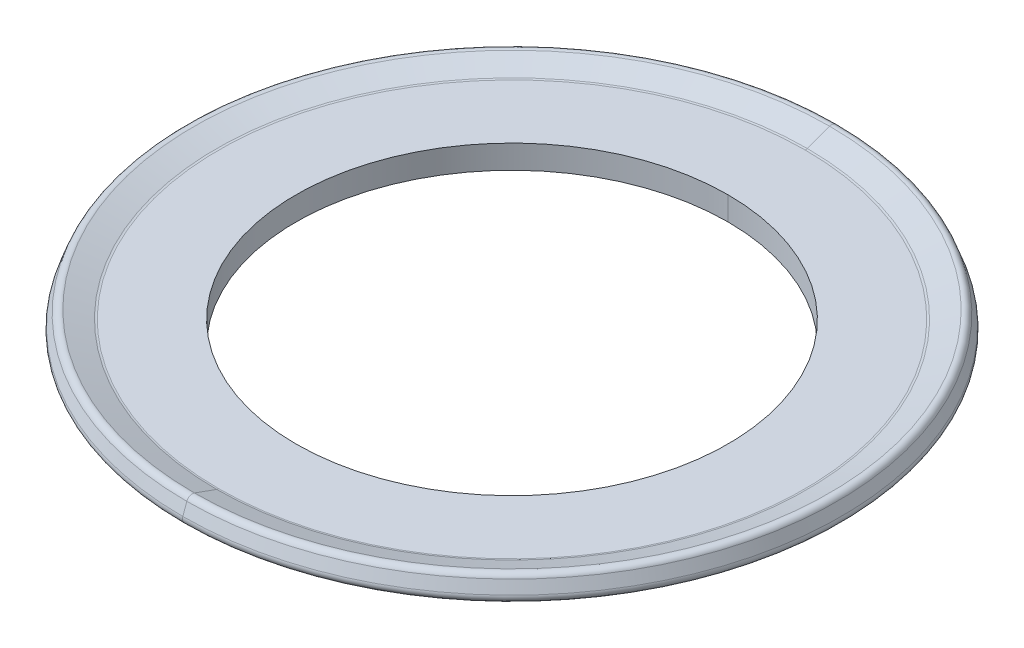
ISO-10303-21;
HEADER;
FILE_DESCRIPTION(('STEP AP214'),'2;1');
FILE_NAME('part.step','',(''),(''),'','','');
FILE_SCHEMA(('AUTOMOTIVE_DESIGN { 1 0 10303 214 1 1 1 1 }'));
ENDSEC;
DATA;
#1=APPLICATION_CONTEXT('core data for automotive mechanical design processes');
#2=APPLICATION_PROTOCOL_DEFINITION('international standard','automotive_design',2000,#1);
#3=PRODUCT_CONTEXT('',#1,'mechanical');
#4=PRODUCT('Part','Part','',(#3));
#5=PRODUCT_RELATED_PRODUCT_CATEGORY('part','',(#4));
#6=PRODUCT_DEFINITION_FORMATION('','',#4);
#7=PRODUCT_DEFINITION_CONTEXT('part definition',#1,'design');
#8=PRODUCT_DEFINITION('design','',#6,#7);
#9=PRODUCT_DEFINITION_SHAPE('','',#8);
#10=(LENGTH_UNIT() NAMED_UNIT(*) SI_UNIT(.MILLI.,.METRE.));
#11=(NAMED_UNIT(*) PLANE_ANGLE_UNIT() SI_UNIT($,.RADIAN.));
#12=(NAMED_UNIT(*) SI_UNIT($,.STERADIAN.) SOLID_ANGLE_UNIT());
#13=UNCERTAINTY_MEASURE_WITH_UNIT(LENGTH_MEASURE(1.E-05),#10,'distance_accuracy_value','');
#14=(GEOMETRIC_REPRESENTATION_CONTEXT(3) GLOBAL_UNCERTAINTY_ASSIGNED_CONTEXT((#13)) GLOBAL_UNIT_ASSIGNED_CONTEXT((#10,
#11,#12)) REPRESENTATION_CONTEXT('',''));
#15=CARTESIAN_POINT('',(0.,0.,0.));
#16=DIRECTION('',(0.,0.,1.));
#17=DIRECTION('',(1.,0.,0.));
#18=AXIS2_PLACEMENT_3D('',#15,#16,#17);
#19=CARTESIAN_POINT('',(0.,0.5,0.));
#20=DIRECTION('',(0.,-1.,0.));
#21=DIRECTION('',(0.,0.,1.));
#22=AXIS2_PLACEMENT_3D('',#19,#20,#21);
#23=TOROIDAL_SURFACE('',#22,12.5718365096458,0.5);
#24=CARTESIAN_POINT('',(0.,0.5,-12.5718365096458));
#25=DIRECTION('',(-1.,0.,0.));
#26=DIRECTION('',(0.,0.,1.));
#27=AXIS2_PLACEMENT_3D('',#24,#25,#26);
#28=CIRCLE('',#27,0.5);
#29=CARTESIAN_POINT('',(0.,0.0301536896070431,-12.7428465813086));
#30=VERTEX_POINT('',#29);
#31=CARTESIAN_POINT('',(0.,0.,-12.5718365096458));
#32=VERTEX_POINT('',#31);
#33=EDGE_CURVE('E170',#30,#32,#28,.T.);
#34=ORIENTED_EDGE('',*,*,#33,.T.);
#35=CARTESIAN_POINT('',(0.,0.,0.));
#36=DIRECTION('',(0.,1.,0.));
#37=DIRECTION('',(0.,0.,1.));
#38=AXIS2_PLACEMENT_3D('',#35,#36,#37);
#39=CIRCLE('',#38,12.5718365096458);
#40=CARTESIAN_POINT('',(0.,0.,12.5718365096458));
#41=VERTEX_POINT('',#40);
#42=EDGE_CURVE('E53',#32,#41,#39,.T.);
#43=ORIENTED_EDGE('',*,*,#42,.T.);
#44=CARTESIAN_POINT('',(0.,0.5,12.5718365096458));
#45=DIRECTION('',(1.,0.,0.));
#46=DIRECTION('',(0.,0.,-1.));
#47=AXIS2_PLACEMENT_3D('',#44,#45,#46);
#48=CIRCLE('',#47,0.5);
#49=CARTESIAN_POINT('',(0.,0.0301536896070431,12.7428465813086));
#50=VERTEX_POINT('',#49);
#51=EDGE_CURVE('E229',#50,#41,#48,.T.);
#52=ORIENTED_EDGE('',*,*,#51,.F.);
#53=CARTESIAN_POINT('',(0.,0.0301536896070431,0.));
#54=DIRECTION('',(0.,-1.,0.));
#55=DIRECTION('',(0.,0.,-1.));
#56=AXIS2_PLACEMENT_3D('',#53,#54,#55);
#57=CIRCLE('',#56,12.7428465813086);
#58=EDGE_CURVE('E159',#50,#30,#57,.T.);
#59=ORIENTED_EDGE('',*,*,#58,.T.);
#60=EDGE_LOOP('',(#34,#43,#52,#59));
#61=FACE_BOUND('',#60,.T.);
#62=ADVANCED_FACE('F42',(#61),#23,.T.);
#63=CARTESIAN_POINT('',(0.,0.655153689607047,0.));
#64=DIRECTION('',(0.,1.,0.));
#65=DIRECTION('',(0.,0.,-1.));
#66=AXIS2_PLACEMENT_3D('',#63,#64,#65);
#67=TOROIDAL_SURFACE('',#66,13.729068868427,0.25);
#68=CARTESIAN_POINT('',(0.,0.655153689607047,13.729068868427));
#69=DIRECTION('',(-1.,0.,0.));
#70=DIRECTION('',(0.,0.,1.));
#71=AXIS2_PLACEMENT_3D('',#68,#69,#70);
#72=CIRCLE('',#71,0.25);
#73=CARTESIAN_POINT('',(0.,0.42023053441057,13.8145739042584));
#74=VERTEX_POINT('',#73);
#75=CARTESIAN_POINT('',(0.,0.740658725438464,13.9639920236234));
#76=VERTEX_POINT('',#75);
#77=EDGE_CURVE('E133',#74,#76,#72,.T.);
#78=ORIENTED_EDGE('',*,*,#77,.T.);
#79=CARTESIAN_POINT('',(0.,0.740658725438464,0.));
#80=DIRECTION('',(0.,-1.,0.));
#81=DIRECTION('',(0.,0.,-1.));
#82=AXIS2_PLACEMENT_3D('',#79,#80,#81);
#83=CIRCLE('',#82,13.9639920236234);
#84=CARTESIAN_POINT('',(0.,0.740658725438464,-13.9639920236234));
#85=VERTEX_POINT('',#84);
#86=EDGE_CURVE('E139',#76,#85,#83,.T.);
#87=ORIENTED_EDGE('',*,*,#86,.T.);
#88=CARTESIAN_POINT('',(0.,0.655153689607047,-13.729068868427));
#89=DIRECTION('',(1.,0.,0.));
#90=DIRECTION('',(0.,0.,-1.));
#91=AXIS2_PLACEMENT_3D('',#88,#89,#90);
#92=CIRCLE('',#91,0.25);
#93=CARTESIAN_POINT('',(0.,0.42023053441057,-13.8145739042584));
#94=VERTEX_POINT('',#93);
#95=EDGE_CURVE('E132',#94,#85,#92,.T.);
#96=ORIENTED_EDGE('',*,*,#95,.F.);
#97=CARTESIAN_POINT('',(0.,0.42023053441057,0.));
#98=DIRECTION('',(0.,1.,0.));
#99=DIRECTION('',(0.,0.,1.));
#100=AXIS2_PLACEMENT_3D('',#97,#98,#99);
#101=CIRCLE('',#100,13.8145739042584);
#102=EDGE_CURVE('E166',#94,#74,#101,.T.);
#103=ORIENTED_EDGE('',*,*,#102,.T.);
#104=EDGE_LOOP('',(#78,#87,#96,#103));
#105=FACE_BOUND('',#104,.T.);
#106=ADVANCED_FACE('F157',(#105),#67,.T.);
#107=CARTESIAN_POINT('',(0.,1.25,0.));
#108=DIRECTION('',(0.,-1.,0.));
#109=DIRECTION('',(0.,0.,1.));
#110=AXIS2_PLACEMENT_3D('',#107,#108,#109);
#111=TOROIDAL_SURFACE('',#110,12.4395912741144,0.25);
#112=CARTESIAN_POINT('',(0.,1.25,-12.4395912741144));
#113=DIRECTION('',(-1.,0.,0.));
#114=DIRECTION('',(0.,0.,1.));
#115=AXIS2_PLACEMENT_3D('',#112,#113,#114);
#116=CIRCLE('',#115,0.25);
#117=CARTESIAN_POINT('',(0.,1.01507684480352,-12.5250963099458));
#118=VERTEX_POINT('',#117);
#119=CARTESIAN_POINT('',(0.,1.,-12.4395912741144));
#120=VERTEX_POINT('',#119);
#121=EDGE_CURVE('E173',#118,#120,#116,.T.);
#122=ORIENTED_EDGE('',*,*,#121,.T.);
#123=CARTESIAN_POINT('',(0.,1.,0.));
#124=DIRECTION('',(0.,-1.,0.));
#125=DIRECTION('',(0.,0.,1.));
#126=AXIS2_PLACEMENT_3D('',#123,#124,#125);
#127=CIRCLE('',#126,12.4395912741144);
#128=CARTESIAN_POINT('',(0.,1.,12.4395912741144));
#129=VERTEX_POINT('',#128);
#130=EDGE_CURVE('E202',#120,#129,#127,.T.);
#131=ORIENTED_EDGE('',*,*,#130,.T.);
#132=CARTESIAN_POINT('',(0.,1.25,12.4395912741144));
#133=DIRECTION('',(1.,0.,0.));
#134=DIRECTION('',(0.,0.,-1.));
#135=AXIS2_PLACEMENT_3D('',#132,#133,#134);
#136=CIRCLE('',#135,0.25);
#137=CARTESIAN_POINT('',(0.,1.01507684480352,12.5250963099458));
#138=VERTEX_POINT('',#137);
#139=EDGE_CURVE('E210',#138,#129,#136,.T.);
#140=ORIENTED_EDGE('',*,*,#139,.F.);
#141=CARTESIAN_POINT('',(0.,1.01507684480352,0.));
#142=DIRECTION('',(0.,1.,0.));
#143=DIRECTION('',(0.,0.,-1.));
#144=AXIS2_PLACEMENT_3D('',#141,#142,#143);
#145=CIRCLE('',#144,12.5250963099458);
#146=EDGE_CURVE('E168',#138,#118,#145,.T.);
#147=ORIENTED_EDGE('',*,*,#146,.T.);
#148=EDGE_LOOP('',(#122,#131,#140,#147));
#149=FACE_BOUND('',#148,.T.);
#150=ADVANCED_FACE('F339',(#149),#111,.F.);
#151=CARTESIAN_POINT('',(0.,0.,0.));
#152=DIRECTION('',(0.,-1.,0.));
#153=DIRECTION('',(0.,0.,1.));
#154=AXIS2_PLACEMENT_3D('',#151,#152,#153);
#155=CYLINDRICAL_SURFACE('',#154,9.16);
#156=DIRECTION('',(0.,-1.,0.));
#157=VECTOR('',#156,1.);
#158=CARTESIAN_POINT('',(0.,0.,-9.16));
#159=LINE('',#158,#157);
#160=CARTESIAN_POINT('',(0.,1.,-9.16));
#161=VERTEX_POINT('',#160);
#162=CARTESIAN_POINT('',(0.,0.,-9.16));
#163=VERTEX_POINT('',#162);
#164=EDGE_CURVE('E196',#161,#163,#159,.T.);
#165=ORIENTED_EDGE('',*,*,#164,.T.);
#166=CARTESIAN_POINT('',(0.,0.,0.));
#167=DIRECTION('',(0.,1.,0.));
#168=DIRECTION('',(0.,0.,1.));
#169=AXIS2_PLACEMENT_3D('',#166,#167,#168);
#170=CIRCLE('',#169,9.16);
#171=CARTESIAN_POINT('',(0.,0.,9.16));
#172=VERTEX_POINT('',#171);
#173=EDGE_CURVE('E11',#172,#163,#170,.T.);
#174=ORIENTED_EDGE('',*,*,#173,.F.);
#175=DIRECTION('',(0.,-1.,0.));
#176=VECTOR('',#175,1.);
#177=CARTESIAN_POINT('',(0.,0.,9.16));
#178=LINE('',#177,#176);
#179=CARTESIAN_POINT('',(0.,1.,9.16));
#180=VERTEX_POINT('',#179);
#181=EDGE_CURVE('E195',#180,#172,#178,.T.);
#182=ORIENTED_EDGE('',*,*,#181,.F.);
#183=CARTESIAN_POINT('',(0.,1.,0.));
#184=DIRECTION('',(0.,1.,0.));
#185=DIRECTION('',(0.,0.,1.));
#186=AXIS2_PLACEMENT_3D('',#183,#184,#185);
#187=CIRCLE('',#186,9.16);
#188=EDGE_CURVE('E205',#180,#161,#187,.T.);
#189=ORIENTED_EDGE('',*,*,#188,.T.);
#190=EDGE_LOOP('',(#165,#174,#182,#189));
#191=FACE_BOUND('',#190,.T.);
#192=ADVANCED_FACE('F274',(#191),#155,.F.);
#193=CARTESIAN_POINT('',(0.,0.,0.));
#194=DIRECTION('',(0.,-1.,0.));
#195=DIRECTION('',(0.,0.,1.));
#196=AXIS2_PLACEMENT_3D('',#193,#194,#195);
#197=PLANE('',#196);
#198=ORIENTED_EDGE('',*,*,#173,.T.);
#199=CARTESIAN_POINT('',(0.,0.,0.));
#200=DIRECTION('',(0.,1.,0.));
#201=DIRECTION('',(0.,0.,1.));
#202=AXIS2_PLACEMENT_3D('',#199,#200,#201);
#203=CIRCLE('',#202,9.16);
#204=EDGE_CURVE('E193',#163,#172,#203,.T.);
#205=ORIENTED_EDGE('',*,*,#204,.T.);
#206=EDGE_LOOP('',(#198,#205));
#207=FACE_BOUND('',#206,.T.);
#208=CARTESIAN_POINT('',(0.,0.,0.));
#209=DIRECTION('',(0.,1.,0.));
#210=DIRECTION('',(0.,0.,1.));
#211=AXIS2_PLACEMENT_3D('',#208,#209,#210);
#212=CIRCLE('',#211,12.5718365096458);
#213=EDGE_CURVE('E246',#41,#32,#212,.T.);
#214=ORIENTED_EDGE('',*,*,#213,.F.);
#215=ORIENTED_EDGE('',*,*,#42,.F.);
#216=EDGE_LOOP('',(#214,#215));
#217=FACE_BOUND('',#216,.T.);
#218=ADVANCED_FACE('F276',(#207,#217),#197,.T.);
#219=CARTESIAN_POINT('',(0.,0.505735570241988,0.));
#220=DIRECTION('',(0.,1.,0.));
#221=DIRECTION('',(0.,0.,-1.));
#222=AXIS2_PLACEMENT_3D('',#219,#220,#221);
#223=CONICAL_SURFACE('',#222,14.0494970594549,1.22173047639603);
#224=DIRECTION('',(0.,0.34202014332567,0.939692620785908));
#225=VECTOR('',#224,1.);
#226=CARTESIAN_POINT('',(0.,0.505735570241988,14.0494970594549));
#227=LINE('',#226,#225);
#228=EDGE_CURVE('E198',#50,#74,#227,.T.);
#229=ORIENTED_EDGE('',*,*,#228,.T.);
#230=ORIENTED_EDGE('',*,*,#102,.F.);
#231=DIRECTION('',(0.,0.34202014332567,-0.939692620785908));
#232=VECTOR('',#231,1.);
#233=CARTESIAN_POINT('',(0.,0.505735570241988,-14.0494970594549));
#234=LINE('',#233,#232);
#235=EDGE_CURVE('E181',#30,#94,#234,.T.);
#236=ORIENTED_EDGE('',*,*,#235,.F.);
#237=ORIENTED_EDGE('',*,*,#58,.F.);
#238=EDGE_LOOP('',(#229,#230,#236,#237));
#239=FACE_BOUND('',#238,.T.);
#240=ADVANCED_FACE('F279',(#239),#223,.T.);
#241=CARTESIAN_POINT('',(0.,1.21050503583142,0.));
#242=DIRECTION('',(0.,-1.,0.));
#243=DIRECTION('',(0.,0.,1.));
#244=AXIS2_PLACEMENT_3D('',#241,#242,#243);
#245=CONICAL_SURFACE('',#244,13.7929819519606,0.349065850398872);
#246=DIRECTION('',(0.,-0.939692620785906,-0.342020143325674));
#247=VECTOR('',#246,1.);
#248=CARTESIAN_POINT('',(0.,1.21050503583142,-13.7929819519606));
#249=LINE('',#248,#247);
#250=CARTESIAN_POINT('',(0.,1.21050503583142,-13.7929819519606));
#251=VERTEX_POINT('',#250);
#252=EDGE_CURVE('E124',#251,#85,#249,.T.);
#253=ORIENTED_EDGE('',*,*,#252,.T.);
#254=ORIENTED_EDGE('',*,*,#86,.F.);
#255=DIRECTION('',(0.,-0.939692620785906,0.342020143325674));
#256=VECTOR('',#255,1.);
#257=CARTESIAN_POINT('',(0.,1.21050503583142,13.7929819519606));
#258=LINE('',#257,#256);
#259=CARTESIAN_POINT('',(0.,1.21050503583142,13.7929819519606));
#260=VERTEX_POINT('',#259);
#261=EDGE_CURVE('E126',#260,#76,#258,.T.);
#262=ORIENTED_EDGE('',*,*,#261,.F.);
#263=CARTESIAN_POINT('',(0.,1.21050503583142,0.));
#264=DIRECTION('',(0.,1.,0.));
#265=DIRECTION('',(0.,0.,1.));
#266=AXIS2_PLACEMENT_3D('',#263,#264,#265);
#267=CIRCLE('',#266,13.7929819519606);
#268=EDGE_CURVE('E142',#251,#260,#267,.T.);
#269=ORIENTED_EDGE('',*,*,#268,.F.);
#270=EDGE_LOOP('',(#253,#254,#262,#269));
#271=FACE_BOUND('',#270,.T.);
#272=ADVANCED_FACE('F137',(#271),#245,.T.);
#273=CARTESIAN_POINT('',(0.,1.125,0.));
#274=DIRECTION('',(0.,-1.,0.));
#275=DIRECTION('',(0.,0.,1.));
#276=AXIS2_PLACEMENT_3D('',#273,#274,#275);
#277=TOROIDAL_SURFACE('',#276,13.5580587967641,0.25);
#278=CARTESIAN_POINT('',(0.,1.125,-13.5580587967641));
#279=DIRECTION('',(-1.,0.,0.));
#280=DIRECTION('',(0.,0.,1.));
#281=AXIS2_PLACEMENT_3D('',#278,#279,#280);
#282=CIRCLE('',#281,0.25);
#283=CARTESIAN_POINT('',(0.,1.35992315519648,-13.4725537609327));
#284=VERTEX_POINT('',#283);
#285=EDGE_CURVE('E46',#284,#251,#282,.T.);
#286=ORIENTED_EDGE('',*,*,#285,.T.);
#287=ORIENTED_EDGE('',*,*,#268,.T.);
#288=CARTESIAN_POINT('',(0.,1.125,13.5580587967641));
#289=DIRECTION('',(1.,0.,0.));
#290=DIRECTION('',(0.,0.,-1.));
#291=AXIS2_PLACEMENT_3D('',#288,#289,#290);
#292=CIRCLE('',#291,0.25);
#293=CARTESIAN_POINT('',(0.,1.35992315519648,13.4725537609327));
#294=VERTEX_POINT('',#293);
#295=EDGE_CURVE('E188',#294,#260,#292,.T.);
#296=ORIENTED_EDGE('',*,*,#295,.F.);
#297=CARTESIAN_POINT('',(0.,1.35992315519648,0.));
#298=DIRECTION('',(0.,1.,0.));
#299=DIRECTION('',(0.,0.,1.));
#300=AXIS2_PLACEMENT_3D('',#297,#298,#299);
#301=CIRCLE('',#300,13.4725537609327);
#302=EDGE_CURVE('E233',#284,#294,#301,.T.);
#303=ORIENTED_EDGE('',*,*,#302,.F.);
#304=EDGE_LOOP('',(#286,#287,#296,#303));
#305=FACE_BOUND('',#304,.T.);
#306=ADVANCED_FACE('F355',(#305),#277,.T.);
#307=CARTESIAN_POINT('',(0.,1.,0.));
#308=DIRECTION('',(0.,1.,0.));
#309=DIRECTION('',(0.,0.,-1.));
#310=AXIS2_PLACEMENT_3D('',#307,#308,#309);
#311=CONICAL_SURFACE('',#310,12.4836730192915,1.22173047639603);
#312=DIRECTION('',(0.,0.34202014332567,0.939692620785908));
#313=VECTOR('',#312,1.);
#314=CARTESIAN_POINT('',(0.,1.,12.4836730192915));
#315=LINE('',#314,#313);
#316=EDGE_CURVE('E192',#138,#294,#315,.T.);
#317=ORIENTED_EDGE('',*,*,#316,.T.);
#318=CARTESIAN_POINT('',(0.,1.35992315519648,0.));
#319=DIRECTION('',(0.,1.,0.));
#320=DIRECTION('',(0.,0.,1.));
#321=AXIS2_PLACEMENT_3D('',#318,#319,#320);
#322=CIRCLE('',#321,13.4725537609327);
#323=EDGE_CURVE('E185',#294,#284,#322,.T.);
#324=ORIENTED_EDGE('',*,*,#323,.T.);
#325=DIRECTION('',(0.,0.34202014332567,-0.939692620785908));
#326=VECTOR('',#325,1.);
#327=CARTESIAN_POINT('',(0.,1.,-12.4836730192915));
#328=LINE('',#327,#326);
#329=EDGE_CURVE('E66',#118,#284,#328,.T.);
#330=ORIENTED_EDGE('',*,*,#329,.F.);
#331=ORIENTED_EDGE('',*,*,#146,.F.);
#332=EDGE_LOOP('',(#317,#324,#330,#331));
#333=FACE_BOUND('',#332,.T.);
#334=ADVANCED_FACE('F438',(#333),#311,.F.);
#335=CARTESIAN_POINT('',(0.,1.,0.));
#336=DIRECTION('',(0.,-1.,0.));
#337=DIRECTION('',(0.,0.,1.));
#338=AXIS2_PLACEMENT_3D('',#335,#336,#337);
#339=PLANE('',#338);
#340=ORIENTED_EDGE('',*,*,#188,.F.);
#341=CARTESIAN_POINT('',(0.,1.,0.));
#342=DIRECTION('',(0.,1.,0.));
#343=DIRECTION('',(0.,0.,1.));
#344=AXIS2_PLACEMENT_3D('',#341,#342,#343);
#345=CIRCLE('',#344,9.16);
#346=EDGE_CURVE('E219',#161,#180,#345,.T.);
#347=ORIENTED_EDGE('',*,*,#346,.F.);
#348=EDGE_LOOP('',(#340,#347));
#349=FACE_BOUND('',#348,.T.);
#350=CARTESIAN_POINT('',(0.,1.,0.));
#351=DIRECTION('',(0.,-1.,0.));
#352=DIRECTION('',(0.,0.,1.));
#353=AXIS2_PLACEMENT_3D('',#350,#351,#352);
#354=CIRCLE('',#353,12.4395912741144);
#355=EDGE_CURVE('E177',#129,#120,#354,.T.);
#356=ORIENTED_EDGE('',*,*,#355,.F.);
#357=ORIENTED_EDGE('',*,*,#130,.F.);
#358=EDGE_LOOP('',(#356,#357));
#359=FACE_BOUND('',#358,.T.);
#360=ADVANCED_FACE('F44',(#349,#359),#339,.F.);
#361=CARTESIAN_POINT('',(0.,1.,0.));
#362=DIRECTION('',(0.,1.,0.));
#363=DIRECTION('',(0.,0.,-1.));
#364=AXIS2_PLACEMENT_3D('',#361,#362,#363);
#365=CONICAL_SURFACE('',#364,12.4836730192915,1.22173047639603);
#366=CARTESIAN_POINT('',(0.,1.01507684480352,0.));
#367=DIRECTION('',(0.,1.,0.));
#368=DIRECTION('',(0.,0.,-1.));
#369=AXIS2_PLACEMENT_3D('',#366,#367,#368);
#370=CIRCLE('',#369,12.5250963099458);
#371=EDGE_CURVE('E155',#118,#138,#370,.T.);
#372=ORIENTED_EDGE('',*,*,#371,.F.);
#373=ORIENTED_EDGE('',*,*,#329,.T.);
#374=ORIENTED_EDGE('',*,*,#302,.T.);
#375=ORIENTED_EDGE('',*,*,#316,.F.);
#376=EDGE_LOOP('',(#372,#373,#374,#375));
#377=FACE_BOUND('',#376,.T.);
#378=ADVANCED_FACE('F420',(#377),#365,.F.);
#379=CARTESIAN_POINT('',(0.,1.125,0.));
#380=DIRECTION('',(0.,-1.,0.));
#381=DIRECTION('',(0.,0.,1.));
#382=AXIS2_PLACEMENT_3D('',#379,#380,#381);
#383=TOROIDAL_SURFACE('',#382,13.5580587967641,0.25);
#384=ORIENTED_EDGE('',*,*,#323,.F.);
#385=ORIENTED_EDGE('',*,*,#295,.T.);
#386=CARTESIAN_POINT('',(0.,1.21050503583142,0.));
#387=DIRECTION('',(0.,1.,0.));
#388=DIRECTION('',(0.,0.,1.));
#389=AXIS2_PLACEMENT_3D('',#386,#387,#388);
#390=CIRCLE('',#389,13.7929819519606);
#391=EDGE_CURVE('E144',#260,#251,#390,.T.);
#392=ORIENTED_EDGE('',*,*,#391,.T.);
#393=ORIENTED_EDGE('',*,*,#285,.F.);
#394=EDGE_LOOP('',(#384,#385,#392,#393));
#395=FACE_BOUND('',#394,.T.);
#396=ADVANCED_FACE('F332',(#395),#383,.T.);
#397=CARTESIAN_POINT('',(0.,1.21050503583142,0.));
#398=DIRECTION('',(0.,-1.,0.));
#399=DIRECTION('',(0.,0.,1.));
#400=AXIS2_PLACEMENT_3D('',#397,#398,#399);
#401=CONICAL_SURFACE('',#400,13.7929819519606,0.349065850398872);
#402=ORIENTED_EDGE('',*,*,#391,.F.);
#403=ORIENTED_EDGE('',*,*,#261,.T.);
#404=CARTESIAN_POINT('',(0.,0.740658725438464,0.));
#405=DIRECTION('',(0.,-1.,0.));
#406=DIRECTION('',(0.,0.,-1.));
#407=AXIS2_PLACEMENT_3D('',#404,#405,#406);
#408=CIRCLE('',#407,13.9639920236234);
#409=EDGE_CURVE('E120',#85,#76,#408,.T.);
#410=ORIENTED_EDGE('',*,*,#409,.F.);
#411=ORIENTED_EDGE('',*,*,#252,.F.);
#412=EDGE_LOOP('',(#402,#403,#410,#411));
#413=FACE_BOUND('',#412,.T.);
#414=ADVANCED_FACE('F123',(#413),#401,.T.);
#415=CARTESIAN_POINT('',(0.,0.505735570241988,0.));
#416=DIRECTION('',(0.,1.,0.));
#417=DIRECTION('',(0.,0.,-1.));
#418=AXIS2_PLACEMENT_3D('',#415,#416,#417);
#419=CONICAL_SURFACE('',#418,14.0494970594549,1.22173047639603);
#420=CARTESIAN_POINT('',(0.,0.0301536896070431,0.));
#421=DIRECTION('',(0.,-1.,0.));
#422=DIRECTION('',(0.,0.,-1.));
#423=AXIS2_PLACEMENT_3D('',#420,#421,#422);
#424=CIRCLE('',#423,12.7428465813086);
#425=EDGE_CURVE('E255',#30,#50,#424,.T.);
#426=ORIENTED_EDGE('',*,*,#425,.F.);
#427=ORIENTED_EDGE('',*,*,#235,.T.);
#428=CARTESIAN_POINT('',(0.,0.42023053441057,0.));
#429=DIRECTION('',(0.,1.,0.));
#430=DIRECTION('',(0.,0.,1.));
#431=AXIS2_PLACEMENT_3D('',#428,#429,#430);
#432=CIRCLE('',#431,13.8145739042584);
#433=EDGE_CURVE('E150',#74,#94,#432,.T.);
#434=ORIENTED_EDGE('',*,*,#433,.F.);
#435=ORIENTED_EDGE('',*,*,#228,.F.);
#436=EDGE_LOOP('',(#426,#427,#434,#435));
#437=FACE_BOUND('',#436,.T.);
#438=ADVANCED_FACE('F331',(#437),#419,.T.);
#439=CARTESIAN_POINT('',(0.,0.,0.));
#440=DIRECTION('',(0.,-1.,0.));
#441=DIRECTION('',(0.,0.,1.));
#442=AXIS2_PLACEMENT_3D('',#439,#440,#441);
#443=CYLINDRICAL_SURFACE('',#442,9.16);
#444=ORIENTED_EDGE('',*,*,#346,.T.);
#445=ORIENTED_EDGE('',*,*,#181,.T.);
#446=ORIENTED_EDGE('',*,*,#204,.F.);
#447=ORIENTED_EDGE('',*,*,#164,.F.);
#448=EDGE_LOOP('',(#444,#445,#446,#447));
#449=FACE_BOUND('',#448,.T.);
#450=ADVANCED_FACE('F269',(#449),#443,.F.);
#451=CARTESIAN_POINT('',(0.,1.25,0.));
#452=DIRECTION('',(0.,-1.,0.));
#453=DIRECTION('',(0.,0.,1.));
#454=AXIS2_PLACEMENT_3D('',#451,#452,#453);
#455=TOROIDAL_SURFACE('',#454,12.4395912741144,0.25);
#456=ORIENTED_EDGE('',*,*,#371,.T.);
#457=ORIENTED_EDGE('',*,*,#139,.T.);
#458=ORIENTED_EDGE('',*,*,#355,.T.);
#459=ORIENTED_EDGE('',*,*,#121,.F.);
#460=EDGE_LOOP('',(#456,#457,#458,#459));
#461=FACE_BOUND('',#460,.T.);
#462=ADVANCED_FACE('F383',(#461),#455,.F.);
#463=CARTESIAN_POINT('',(0.,0.655153689607047,0.));
#464=DIRECTION('',(0.,1.,0.));
#465=DIRECTION('',(0.,0.,-1.));
#466=AXIS2_PLACEMENT_3D('',#463,#464,#465);
#467=TOROIDAL_SURFACE('',#466,13.729068868427,0.25);
#468=ORIENTED_EDGE('',*,*,#433,.T.);
#469=ORIENTED_EDGE('',*,*,#95,.T.);
#470=ORIENTED_EDGE('',*,*,#409,.T.);
#471=ORIENTED_EDGE('',*,*,#77,.F.);
#472=EDGE_LOOP('',(#468,#469,#470,#471));
#473=FACE_BOUND('',#472,.T.);
#474=ADVANCED_FACE('F148',(#473),#467,.T.);
#475=CARTESIAN_POINT('',(0.,0.5,0.));
#476=DIRECTION('',(0.,-1.,0.));
#477=DIRECTION('',(0.,0.,1.));
#478=AXIS2_PLACEMENT_3D('',#475,#476,#477);
#479=TOROIDAL_SURFACE('',#478,12.5718365096458,0.5);
#480=ORIENTED_EDGE('',*,*,#425,.T.);
#481=ORIENTED_EDGE('',*,*,#51,.T.);
#482=ORIENTED_EDGE('',*,*,#213,.T.);
#483=ORIENTED_EDGE('',*,*,#33,.F.);
#484=EDGE_LOOP('',(#480,#481,#482,#483));
#485=FACE_BOUND('',#484,.T.);
#486=ADVANCED_FACE('F291',(#485),#479,.T.);
#487=CLOSED_SHELL('',(#62,#106,#150,#192,#218,#240,#272,#306,#334,#360,#378,#396,#414,#438,#450,
#462,#474,#486));
#488=MANIFOLD_SOLID_BREP('B2',#487);
#489=ADVANCED_BREP_SHAPE_REPRESENTATION('',(#18,#488),#14);
#490=SHAPE_DEFINITION_REPRESENTATION(#9,#489);
ENDSEC;
END-ISO-10303-21;
